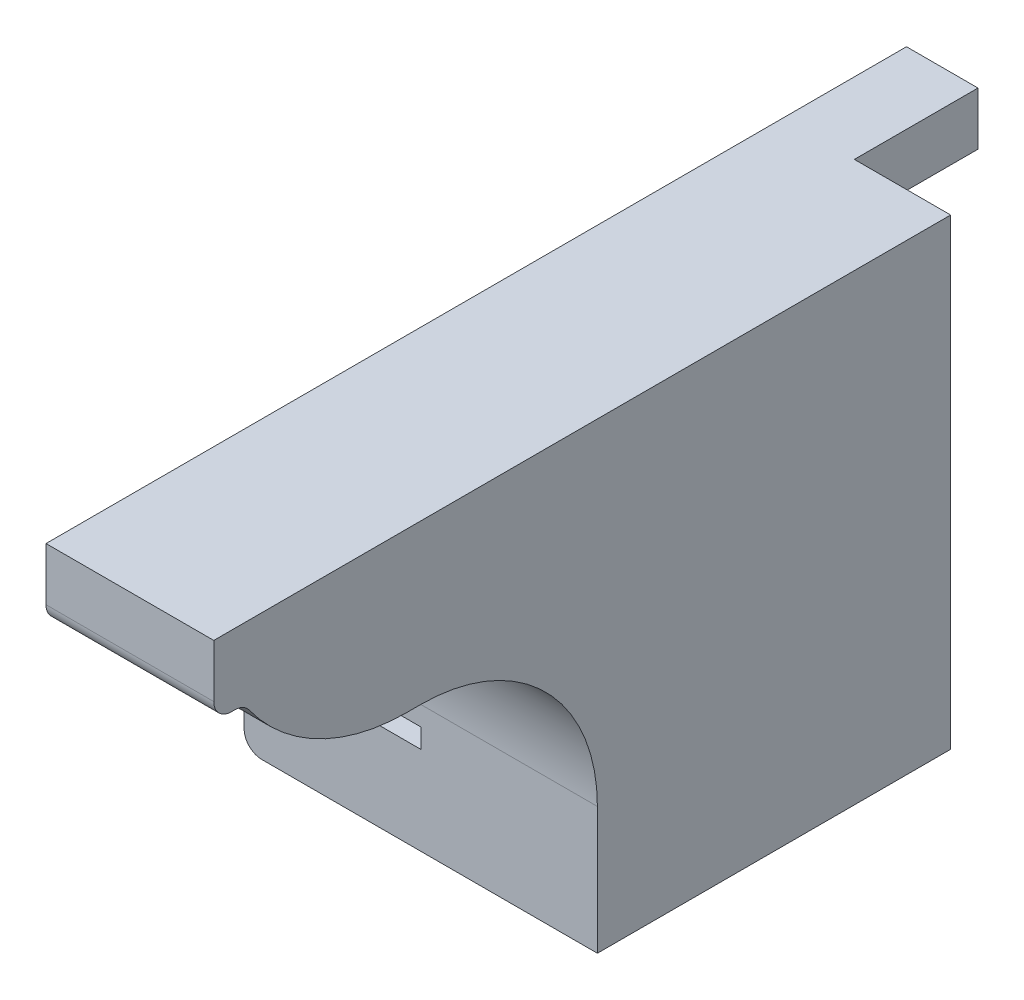
ISO-10303-21;
HEADER;
FILE_DESCRIPTION(('STEP AP214'),'2;1');
FILE_NAME('part.step','',(''),(''),'','','');
FILE_SCHEMA(('AUTOMOTIVE_DESIGN { 1 0 10303 214 1 1 1 1 }'));
ENDSEC;
DATA;
#1=APPLICATION_CONTEXT('core data for automotive mechanical design processes');
#2=APPLICATION_PROTOCOL_DEFINITION('international standard','automotive_design',2000,#1);
#3=PRODUCT_CONTEXT('',#1,'mechanical');
#4=PRODUCT('Part','Part','',(#3));
#5=PRODUCT_RELATED_PRODUCT_CATEGORY('part','',(#4));
#6=PRODUCT_DEFINITION_FORMATION('','',#4);
#7=PRODUCT_DEFINITION_CONTEXT('part definition',#1,'design');
#8=PRODUCT_DEFINITION('design','',#6,#7);
#9=PRODUCT_DEFINITION_SHAPE('','',#8);
#10=(LENGTH_UNIT() NAMED_UNIT(*) SI_UNIT(.MILLI.,.METRE.));
#11=(NAMED_UNIT(*) PLANE_ANGLE_UNIT() SI_UNIT($,.RADIAN.));
#12=(NAMED_UNIT(*) SI_UNIT($,.STERADIAN.) SOLID_ANGLE_UNIT());
#13=UNCERTAINTY_MEASURE_WITH_UNIT(LENGTH_MEASURE(1.E-05),#10,'distance_accuracy_value','');
#14=(GEOMETRIC_REPRESENTATION_CONTEXT(3) GLOBAL_UNCERTAINTY_ASSIGNED_CONTEXT((#13)) GLOBAL_UNIT_ASSIGNED_CONTEXT((#10,
#11,#12)) REPRESENTATION_CONTEXT('',''));
#15=CARTESIAN_POINT('',(0.,0.,0.));
#16=DIRECTION('',(0.,0.,1.));
#17=DIRECTION('',(1.,0.,0.));
#18=AXIS2_PLACEMENT_3D('',#15,#16,#17);
#19=CARTESIAN_POINT('',(0.,0.,10.));
#20=DIRECTION('',(0.,-1.,0.));
#21=DIRECTION('',(0.,0.,-1.));
#22=AXIS2_PLACEMENT_3D('',#19,#20,#21);
#23=PLANE('',#22);
#24=DIRECTION('',(0.,0.,-1.));
#25=VECTOR('',#24,1.);
#26=CARTESIAN_POINT('',(0.5,0.,31.718482058147));
#27=LINE('',#26,#25);
#28=CARTESIAN_POINT('',(0.5,0.,30.));
#29=VERTEX_POINT('',#28);
#30=CARTESIAN_POINT('',(0.5,0.,0.));
#31=VERTEX_POINT('',#30);
#32=EDGE_CURVE('E278',#29,#31,#27,.T.);
#33=ORIENTED_EDGE('',*,*,#32,.T.);
#34=DIRECTION('',(-1.,0.,0.));
#35=VECTOR('',#34,1.);
#36=CARTESIAN_POINT('',(0.,0.,0.));
#37=LINE('',#36,#35);
#38=CARTESIAN_POINT('',(0.,0.,0.));
#39=VERTEX_POINT('',#38);
#40=EDGE_CURVE('E331',#31,#39,#37,.T.);
#41=ORIENTED_EDGE('',*,*,#40,.T.);
#42=DIRECTION('',(0.,0.,-1.));
#43=VECTOR('',#42,1.);
#44=CARTESIAN_POINT('',(0.,0.,10.));
#45=LINE('',#44,#43);
#46=CARTESIAN_POINT('',(0.,0.,30.));
#47=VERTEX_POINT('',#46);
#48=EDGE_CURVE('E356',#47,#39,#45,.T.);
#49=ORIENTED_EDGE('',*,*,#48,.F.);
#50=DIRECTION('',(-1.,0.,0.));
#51=VECTOR('',#50,1.);
#52=CARTESIAN_POINT('',(10.,0.,30.));
#53=LINE('',#52,#51);
#54=EDGE_CURVE('E308',#29,#47,#53,.T.);
#55=ORIENTED_EDGE('',*,*,#54,.F.);
#56=EDGE_LOOP('',(#33,#41,#49,#55));
#57=FACE_BOUND('',#56,.T.);
#58=ADVANCED_FACE('F33',(#57),#23,.F.);
#59=CARTESIAN_POINT('',(0.,0.,10.));
#60=DIRECTION('',(0.,0.,-1.));
#61=DIRECTION('',(-1.,0.,0.));
#62=AXIS2_PLACEMENT_3D('',#59,#60,#61);
#63=PLANE('',#62);
#64=DIRECTION('',(0.,-1.,0.));
#65=VECTOR('',#64,1.);
#66=CARTESIAN_POINT('',(-10.,-22.2,10.));
#67=LINE('',#66,#65);
#68=CARTESIAN_POINT('',(-10.,-18.2,10.));
#69=VERTEX_POINT('',#68);
#70=CARTESIAN_POINT('',(-10.,-21.2,10.));
#71=VERTEX_POINT('',#70);
#72=EDGE_CURVE('E348',#69,#71,#67,.T.);
#73=ORIENTED_EDGE('',*,*,#72,.T.);
#74=CARTESIAN_POINT('',(-9.,-21.2,10.));
#75=DIRECTION('',(0.,0.,-1.));
#76=DIRECTION('',(-1.,0.,0.));
#77=AXIS2_PLACEMENT_3D('',#74,#75,#76);
#78=CIRCLE('',#77,1.);
#79=CARTESIAN_POINT('',(-9.,-22.2,10.));
#80=VERTEX_POINT('',#79);
#81=EDGE_CURVE('E462',#71,#80,#78,.F.);
#82=ORIENTED_EDGE('',*,*,#81,.T.);
#83=DIRECTION('',(1.,0.,0.));
#84=VECTOR('',#83,1.);
#85=CARTESIAN_POINT('',(10.,-22.2,10.));
#86=LINE('',#85,#84);
#87=CARTESIAN_POINT('',(10.,-22.2,10.));
#88=VERTEX_POINT('',#87);
#89=EDGE_CURVE('E351',#80,#88,#86,.T.);
#90=ORIENTED_EDGE('',*,*,#89,.T.);
#91=DIRECTION('',(0.,1.,0.));
#92=VECTOR('',#91,1.);
#93=CARTESIAN_POINT('',(10.,0.,10.));
#94=LINE('',#93,#92);
#95=CARTESIAN_POINT('',(10.,-15.,10.));
#96=VERTEX_POINT('',#95);
#97=EDGE_CURVE('E353',#88,#96,#94,.T.);
#98=ORIENTED_EDGE('',*,*,#97,.T.);
#99=DIRECTION('',(1.,0.,0.));
#100=VECTOR('',#99,1.);
#101=CARTESIAN_POINT('',(0.,-15.,10.));
#102=LINE('',#101,#100);
#103=CARTESIAN_POINT('',(0.,-15.,10.));
#104=VERTEX_POINT('',#103);
#105=EDGE_CURVE('E412',#96,#104,#102,.F.);
#106=ORIENTED_EDGE('',*,*,#105,.T.);
#107=DIRECTION('',(0.,1.,0.));
#108=VECTOR('',#107,1.);
#109=CARTESIAN_POINT('',(0.,-5.,10.));
#110=LINE('',#109,#108);
#111=CARTESIAN_POINT('',(0.,-11.1,10.));
#112=VERTEX_POINT('',#111);
#113=EDGE_CURVE('E409',#104,#112,#110,.T.);
#114=ORIENTED_EDGE('',*,*,#113,.T.);
#115=DIRECTION('',(-1.,0.,0.));
#116=VECTOR('',#115,1.);
#117=CARTESIAN_POINT('',(-10.,-11.1,10.));
#118=LINE('',#117,#116);
#119=CARTESIAN_POINT('',(-9.,-11.1,10.));
#120=VERTEX_POINT('',#119);
#121=EDGE_CURVE('E335',#112,#120,#118,.T.);
#122=ORIENTED_EDGE('',*,*,#121,.T.);
#123=CARTESIAN_POINT('',(-9.,-12.1,10.));
#124=DIRECTION('',(0.,0.,-1.));
#125=DIRECTION('',(-1.,0.,0.));
#126=AXIS2_PLACEMENT_3D('',#123,#124,#125);
#127=CIRCLE('',#126,1.);
#128=CARTESIAN_POINT('',(-10.,-12.1,10.));
#129=VERTEX_POINT('',#128);
#130=EDGE_CURVE('E456',#120,#129,#127,.F.);
#131=ORIENTED_EDGE('',*,*,#130,.T.);
#132=DIRECTION('',(0.,-1.,0.));
#133=VECTOR('',#132,1.);
#134=CARTESIAN_POINT('',(-10.,-16.1,10.));
#135=LINE('',#134,#133);
#136=CARTESIAN_POINT('',(-10.,-15.1,10.));
#137=VERTEX_POINT('',#136);
#138=EDGE_CURVE('E338',#129,#137,#135,.T.);
#139=ORIENTED_EDGE('',*,*,#138,.T.);
#140=CARTESIAN_POINT('',(-9.,-15.1,10.));
#141=DIRECTION('',(0.,0.,-1.));
#142=DIRECTION('',(-1.,0.,0.));
#143=AXIS2_PLACEMENT_3D('',#140,#141,#142);
#144=CIRCLE('',#143,1.);
#145=CARTESIAN_POINT('',(-9.,-16.1,10.));
#146=VERTEX_POINT('',#145);
#147=EDGE_CURVE('E458',#137,#146,#144,.F.);
#148=ORIENTED_EDGE('',*,*,#147,.T.);
#149=DIRECTION('',(1.,0.,0.));
#150=VECTOR('',#149,1.);
#151=CARTESIAN_POINT('',(0.,-16.1,10.));
#152=LINE('',#151,#150);
#153=CARTESIAN_POINT('',(0.,-16.1,10.));
#154=VERTEX_POINT('',#153);
#155=EDGE_CURVE('E341',#146,#154,#152,.T.);
#156=ORIENTED_EDGE('',*,*,#155,.T.);
#157=DIRECTION('',(0.,-1.,0.));
#158=VECTOR('',#157,1.);
#159=CARTESIAN_POINT('',(0.,-17.2,10.));
#160=LINE('',#159,#158);
#161=CARTESIAN_POINT('',(0.,-17.2,10.));
#162=VERTEX_POINT('',#161);
#163=EDGE_CURVE('E343',#154,#162,#160,.T.);
#164=ORIENTED_EDGE('',*,*,#163,.T.);
#165=DIRECTION('',(-1.,0.,0.));
#166=VECTOR('',#165,1.);
#167=CARTESIAN_POINT('',(-10.,-17.2,10.));
#168=LINE('',#167,#166);
#169=CARTESIAN_POINT('',(-9.,-17.2,10.));
#170=VERTEX_POINT('',#169);
#171=EDGE_CURVE('E345',#162,#170,#168,.T.);
#172=ORIENTED_EDGE('',*,*,#171,.T.);
#173=CARTESIAN_POINT('',(-9.,-18.2,10.));
#174=DIRECTION('',(0.,0.,-1.));
#175=DIRECTION('',(-1.,0.,0.));
#176=AXIS2_PLACEMENT_3D('',#173,#174,#175);
#177=CIRCLE('',#176,1.);
#178=EDGE_CURVE('E460',#170,#69,#177,.F.);
#179=ORIENTED_EDGE('',*,*,#178,.T.);
#180=EDGE_LOOP('',(#73,#82,#90,#98,#106,#114,#122,#131,#139,#148,#156,#164,#172,#179));
#181=FACE_BOUND('',#180,.T.);
#182=ADVANCED_FACE('F555',(#181),#63,.F.);
#183=DIRECTION('',(0.707106781186549,0.707106781186546,0.));
#184=VECTOR('',#183,1.);
#185=CARTESIAN_POINT('',(-10.,-9.00000000000001,10.));
#186=LINE('',#185,#184);
#187=CARTESIAN_POINT('',(-5.99999999999998,-5.,10.));
#188=VERTEX_POINT('',#187);
#189=CARTESIAN_POINT('',(-9.70710678118655,-8.70710678118656,10.));
#190=VERTEX_POINT('',#189);
#191=EDGE_CURVE('E424',#188,#190,#186,.F.);
#192=ORIENTED_EDGE('',*,*,#191,.T.);
#193=CARTESIAN_POINT('',(-9.,-9.41421356237311,10.));
#194=DIRECTION('',(0.,0.,-1.));
#195=DIRECTION('',(-1.,0.,0.));
#196=AXIS2_PLACEMENT_3D('',#193,#194,#195);
#197=CIRCLE('',#196,1.);
#198=CARTESIAN_POINT('',(-9.97831834347852,-9.20710678118656,10.));
#199=VERTEX_POINT('',#198);
#200=EDGE_CURVE('E444',#190,#199,#197,.F.);
#201=ORIENTED_EDGE('',*,*,#200,.T.);
#202=CARTESIAN_POINT('',(-9.,-9.,10.));
#203=DIRECTION('',(0.,0.,-1.));
#204=DIRECTION('',(-1.,0.,0.));
#205=AXIS2_PLACEMENT_3D('',#202,#203,#204);
#206=CIRCLE('',#205,1.);
#207=CARTESIAN_POINT('',(-9.,-10.,10.));
#208=VERTEX_POINT('',#207);
#209=EDGE_CURVE('E442',#199,#208,#206,.F.);
#210=ORIENTED_EDGE('',*,*,#209,.T.);
#211=DIRECTION('',(1.,0.,0.));
#212=VECTOR('',#211,1.);
#213=CARTESIAN_POINT('',(0.,-10.,10.));
#214=LINE('',#213,#212);
#215=CARTESIAN_POINT('',(0.,-10.,10.));
#216=VERTEX_POINT('',#215);
#217=EDGE_CURVE('E330',#208,#216,#214,.T.);
#218=ORIENTED_EDGE('',*,*,#217,.T.);
#219=DIRECTION('',(0.,1.,0.));
#220=VECTOR('',#219,1.);
#221=CARTESIAN_POINT('',(0.,-5.,10.));
#222=LINE('',#221,#220);
#223=CARTESIAN_POINT('',(0.,-5.,10.));
#224=VERTEX_POINT('',#223);
#225=EDGE_CURVE('E407',#216,#224,#222,.T.);
#226=ORIENTED_EDGE('',*,*,#225,.T.);
#227=DIRECTION('',(-1.,0.,0.));
#228=VECTOR('',#227,1.);
#229=CARTESIAN_POINT('',(-10.,-5.,10.));
#230=LINE('',#229,#228);
#231=EDGE_CURVE('E327',#224,#188,#230,.T.);
#232=ORIENTED_EDGE('',*,*,#231,.T.);
#233=EDGE_LOOP('',(#192,#201,#210,#218,#226,#232));
#234=FACE_BOUND('',#233,.T.);
#235=ADVANCED_FACE('F629',(#234),#63,.F.);
#236=CARTESIAN_POINT('',(0.,-5.,10.));
#237=DIRECTION('',(1.,0.,0.));
#238=DIRECTION('',(0.,0.,-1.));
#239=AXIS2_PLACEMENT_3D('',#236,#237,#238);
#240=PLANE('',#239);
#241=DIRECTION('',(0.,0.,-1.));
#242=VECTOR('',#241,1.);
#243=CARTESIAN_POINT('',(0.,-5.,30.));
#244=LINE('',#243,#242);
#245=CARTESIAN_POINT('',(0.,-5.,20.7804555427071));
#246=VERTEX_POINT('',#245);
#247=CARTESIAN_POINT('',(0.,-5.,20.));
#248=VERTEX_POINT('',#247);
#249=EDGE_CURVE('E313',#246,#248,#244,.T.);
#250=ORIENTED_EDGE('',*,*,#249,.F.);
#251=CARTESIAN_POINT('',(0.,6.,20.7804555427071));
#252=DIRECTION('',(1.,0.,0.));
#253=DIRECTION('',(0.,0.,-1.));
#254=AXIS2_PLACEMENT_3D('',#251,#252,#253);
#255=CIRCLE('',#254,11.);
#256=EDGE_CURVE('E482',#246,#47,#255,.F.);
#257=ORIENTED_EDGE('',*,*,#256,.T.);
#258=ORIENTED_EDGE('',*,*,#48,.T.);
#259=DIRECTION('',(0.,-1.,0.));
#260=VECTOR('',#259,1.);
#261=CARTESIAN_POINT('',(0.,-5.,0.));
#262=LINE('',#261,#260);
#263=CARTESIAN_POINT('',(0.,-5.,0.));
#264=VERTEX_POINT('',#263);
#265=EDGE_CURVE('E326',#39,#264,#262,.T.);
#266=ORIENTED_EDGE('',*,*,#265,.T.);
#267=DIRECTION('',(0.,0.,-1.));
#268=VECTOR('',#267,1.);
#269=CARTESIAN_POINT('',(0.,-5.,10.));
#270=LINE('',#269,#268);
#271=EDGE_CURVE('E401',#224,#264,#270,.T.);
#272=ORIENTED_EDGE('',*,*,#271,.F.);
#273=ORIENTED_EDGE('',*,*,#225,.F.);
#274=DIRECTION('',(0.,-1.,0.));
#275=VECTOR('',#274,1.);
#276=CARTESIAN_POINT('',(0.,-11.1,10.));
#277=LINE('',#276,#275);
#278=EDGE_CURVE('E333',#216,#112,#277,.T.);
#279=ORIENTED_EDGE('',*,*,#278,.T.);
#280=ORIENTED_EDGE('',*,*,#113,.F.);
#281=CARTESIAN_POINT('',(0.,-15.,20.));
#282=DIRECTION('',(1.,0.,0.));
#283=DIRECTION('',(0.,0.,-1.));
#284=AXIS2_PLACEMENT_3D('',#281,#282,#283);
#285=CIRCLE('',#284,10.);
#286=EDGE_CURVE('E417',#104,#248,#285,.T.);
#287=ORIENTED_EDGE('',*,*,#286,.T.);
#288=EDGE_LOOP('',(#250,#257,#258,#266,#272,#273,#279,#280,#287));
#289=FACE_BOUND('',#288,.T.);
#290=ADVANCED_FACE('F544',(#289),#240,.F.);
#291=CARTESIAN_POINT('',(-10.,-5.,10.));
#292=DIRECTION('',(0.,-1.,0.));
#293=DIRECTION('',(0.,0.,-1.));
#294=AXIS2_PLACEMENT_3D('',#291,#292,#293);
#295=PLANE('',#294);
#296=DIRECTION('',(-1.,0.,0.));
#297=VECTOR('',#296,1.);
#298=CARTESIAN_POINT('',(-10.,-5.,0.));
#299=LINE('',#298,#297);
#300=CARTESIAN_POINT('',(-5.99999999999998,-5.,0.));
#301=VERTEX_POINT('',#300);
#302=EDGE_CURVE('E359',#264,#301,#299,.T.);
#303=ORIENTED_EDGE('',*,*,#302,.T.);
#304=DIRECTION('',(0.,0.,1.));
#305=VECTOR('',#304,1.);
#306=CARTESIAN_POINT('',(-5.99999999999998,-5.,10.));
#307=LINE('',#306,#305);
#308=EDGE_CURVE('E422',#301,#188,#307,.T.);
#309=ORIENTED_EDGE('',*,*,#308,.T.);
#310=ORIENTED_EDGE('',*,*,#231,.F.);
#311=ORIENTED_EDGE('',*,*,#271,.T.);
#312=EDGE_LOOP('',(#303,#309,#310,#311));
#313=FACE_BOUND('',#312,.T.);
#314=ADVANCED_FACE('F626',(#313),#295,.F.);
#315=CARTESIAN_POINT('',(0.,-10.,10.));
#316=DIRECTION('',(0.,1.,0.));
#317=DIRECTION('',(-1.,0.,0.));
#318=AXIS2_PLACEMENT_3D('',#315,#316,#317);
#319=PLANE('',#318);
#320=ORIENTED_EDGE('',*,*,#217,.F.);
#321=DIRECTION('',(0.,0.,-1.));
#322=VECTOR('',#321,1.);
#323=CARTESIAN_POINT('',(-9.,-10.,10.));
#324=LINE('',#323,#322);
#325=CARTESIAN_POINT('',(-9.,-10.,0.));
#326=VERTEX_POINT('',#325);
#327=EDGE_CURVE('E446',#208,#326,#324,.T.);
#328=ORIENTED_EDGE('',*,*,#327,.T.);
#329=DIRECTION('',(1.,0.,0.));
#330=VECTOR('',#329,1.);
#331=CARTESIAN_POINT('',(0.,-10.,0.));
#332=LINE('',#331,#330);
#333=CARTESIAN_POINT('',(0.,-10.,0.));
#334=VERTEX_POINT('',#333);
#335=EDGE_CURVE('E362',#326,#334,#332,.T.);
#336=ORIENTED_EDGE('',*,*,#335,.T.);
#337=DIRECTION('',(0.,0.,-1.));
#338=VECTOR('',#337,1.);
#339=CARTESIAN_POINT('',(0.,-10.,10.));
#340=LINE('',#339,#338);
#341=EDGE_CURVE('E398',#216,#334,#340,.T.);
#342=ORIENTED_EDGE('',*,*,#341,.F.);
#343=EDGE_LOOP('',(#320,#328,#336,#342));
#344=FACE_BOUND('',#343,.T.);
#345=ADVANCED_FACE('F632',(#344),#319,.F.);
#346=CARTESIAN_POINT('',(0.,-11.1,10.));
#347=DIRECTION('',(1.,0.,0.));
#348=DIRECTION('',(0.,0.,-1.));
#349=AXIS2_PLACEMENT_3D('',#346,#347,#348);
#350=PLANE('',#349);
#351=DIRECTION('',(0.,-1.,0.));
#352=VECTOR('',#351,1.);
#353=CARTESIAN_POINT('',(0.,-11.1,0.));
#354=LINE('',#353,#352);
#355=CARTESIAN_POINT('',(0.,-11.1,0.));
#356=VERTEX_POINT('',#355);
#357=EDGE_CURVE('E364',#334,#356,#354,.T.);
#358=ORIENTED_EDGE('',*,*,#357,.T.);
#359=DIRECTION('',(0.,0.,-1.));
#360=VECTOR('',#359,1.);
#361=CARTESIAN_POINT('',(0.,-11.1,10.));
#362=LINE('',#361,#360);
#363=EDGE_CURVE('E395',#112,#356,#362,.T.);
#364=ORIENTED_EDGE('',*,*,#363,.F.);
#365=ORIENTED_EDGE('',*,*,#278,.F.);
#366=ORIENTED_EDGE('',*,*,#341,.T.);
#367=EDGE_LOOP('',(#358,#364,#365,#366));
#368=FACE_BOUND('',#367,.T.);
#369=ADVANCED_FACE('F605',(#368),#350,.F.);
#370=CARTESIAN_POINT('',(-10.,-11.1,10.));
#371=DIRECTION('',(0.,-1.,0.));
#372=DIRECTION('',(0.,0.,-1.));
#373=AXIS2_PLACEMENT_3D('',#370,#371,#372);
#374=PLANE('',#373);
#375=DIRECTION('',(-1.,0.,0.));
#376=VECTOR('',#375,1.);
#377=CARTESIAN_POINT('',(-10.,-11.1,0.));
#378=LINE('',#377,#376);
#379=CARTESIAN_POINT('',(-9.,-11.1,0.));
#380=VERTEX_POINT('',#379);
#381=EDGE_CURVE('E366',#356,#380,#378,.T.);
#382=ORIENTED_EDGE('',*,*,#381,.T.);
#383=DIRECTION('',(0.,0.,-1.));
#384=VECTOR('',#383,1.);
#385=CARTESIAN_POINT('',(-9.,-11.1,10.));
#386=LINE('',#385,#384);
#387=EDGE_CURVE('E474',#380,#120,#386,.F.);
#388=ORIENTED_EDGE('',*,*,#387,.T.);
#389=ORIENTED_EDGE('',*,*,#121,.F.);
#390=ORIENTED_EDGE('',*,*,#363,.T.);
#391=EDGE_LOOP('',(#382,#388,#389,#390));
#392=FACE_BOUND('',#391,.T.);
#393=ADVANCED_FACE('F602',(#392),#374,.F.);
#394=CARTESIAN_POINT('',(-10.,-16.1,10.));
#395=DIRECTION('',(1.,0.,0.));
#396=DIRECTION('',(0.,0.,-1.));
#397=AXIS2_PLACEMENT_3D('',#394,#395,#396);
#398=PLANE('',#397);
#399=DIRECTION('',(0.,-1.,0.));
#400=VECTOR('',#399,1.);
#401=CARTESIAN_POINT('',(-10.,-16.1,0.));
#402=LINE('',#401,#400);
#403=CARTESIAN_POINT('',(-10.,-12.1,0.));
#404=VERTEX_POINT('',#403);
#405=CARTESIAN_POINT('',(-10.,-15.1,0.));
#406=VERTEX_POINT('',#405);
#407=EDGE_CURVE('E369',#404,#406,#402,.T.);
#408=ORIENTED_EDGE('',*,*,#407,.T.);
#409=DIRECTION('',(0.,0.,-1.));
#410=VECTOR('',#409,1.);
#411=CARTESIAN_POINT('',(-10.,-15.1,10.));
#412=LINE('',#411,#410);
#413=EDGE_CURVE('E472',#406,#137,#412,.F.);
#414=ORIENTED_EDGE('',*,*,#413,.T.);
#415=ORIENTED_EDGE('',*,*,#138,.F.);
#416=DIRECTION('',(0.,0.,-1.));
#417=VECTOR('',#416,1.);
#418=CARTESIAN_POINT('',(-10.,-12.1,10.));
#419=LINE('',#418,#417);
#420=EDGE_CURVE('E469',#129,#404,#419,.T.);
#421=ORIENTED_EDGE('',*,*,#420,.T.);
#422=EDGE_LOOP('',(#408,#414,#415,#421));
#423=FACE_BOUND('',#422,.T.);
#424=ADVANCED_FACE('F592',(#423),#398,.F.);
#425=CARTESIAN_POINT('',(0.,-16.1,10.));
#426=DIRECTION('',(0.,1.,0.));
#427=DIRECTION('',(-1.,0.,0.));
#428=AXIS2_PLACEMENT_3D('',#425,#426,#427);
#429=PLANE('',#428);
#430=ORIENTED_EDGE('',*,*,#155,.F.);
#431=DIRECTION('',(0.,0.,-1.));
#432=VECTOR('',#431,1.);
#433=CARTESIAN_POINT('',(-9.,-16.1,10.));
#434=LINE('',#433,#432);
#435=CARTESIAN_POINT('',(-9.,-16.1,0.));
#436=VERTEX_POINT('',#435);
#437=EDGE_CURVE('E466',#146,#436,#434,.T.);
#438=ORIENTED_EDGE('',*,*,#437,.T.);
#439=DIRECTION('',(1.,0.,0.));
#440=VECTOR('',#439,1.);
#441=CARTESIAN_POINT('',(0.,-16.1,0.));
#442=LINE('',#441,#440);
#443=CARTESIAN_POINT('',(0.,-16.1,0.));
#444=VERTEX_POINT('',#443);
#445=EDGE_CURVE('E372',#436,#444,#442,.T.);
#446=ORIENTED_EDGE('',*,*,#445,.T.);
#447=DIRECTION('',(0.,0.,-1.));
#448=VECTOR('',#447,1.);
#449=CARTESIAN_POINT('',(0.,-16.1,10.));
#450=LINE('',#449,#448);
#451=EDGE_CURVE('E392',#154,#444,#450,.T.);
#452=ORIENTED_EDGE('',*,*,#451,.F.);
#453=EDGE_LOOP('',(#430,#438,#446,#452));
#454=FACE_BOUND('',#453,.T.);
#455=ADVANCED_FACE('F584',(#454),#429,.F.);
#456=CARTESIAN_POINT('',(0.,-17.2,10.));
#457=DIRECTION('',(1.,0.,0.));
#458=DIRECTION('',(0.,1.,0.));
#459=AXIS2_PLACEMENT_3D('',#456,#457,#458);
#460=PLANE('',#459);
#461=DIRECTION('',(0.,-1.,0.));
#462=VECTOR('',#461,1.);
#463=CARTESIAN_POINT('',(0.,-17.2,0.));
#464=LINE('',#463,#462);
#465=CARTESIAN_POINT('',(0.,-17.2,0.));
#466=VERTEX_POINT('',#465);
#467=EDGE_CURVE('E374',#444,#466,#464,.T.);
#468=ORIENTED_EDGE('',*,*,#467,.T.);
#469=DIRECTION('',(0.,0.,-1.));
#470=VECTOR('',#469,1.);
#471=CARTESIAN_POINT('',(0.,-17.2,10.));
#472=LINE('',#471,#470);
#473=EDGE_CURVE('E389',#162,#466,#472,.T.);
#474=ORIENTED_EDGE('',*,*,#473,.F.);
#475=ORIENTED_EDGE('',*,*,#163,.F.);
#476=ORIENTED_EDGE('',*,*,#451,.T.);
#477=EDGE_LOOP('',(#468,#474,#475,#476));
#478=FACE_BOUND('',#477,.T.);
#479=ADVANCED_FACE('F578',(#478),#460,.F.);
#480=CARTESIAN_POINT('',(-10.,-17.2,10.));
#481=DIRECTION('',(0.,-1.,0.));
#482=DIRECTION('',(1.,0.,0.));
#483=AXIS2_PLACEMENT_3D('',#480,#481,#482);
#484=PLANE('',#483);
#485=DIRECTION('',(-1.,0.,0.));
#486=VECTOR('',#485,1.);
#487=CARTESIAN_POINT('',(-10.,-17.2,0.));
#488=LINE('',#487,#486);
#489=CARTESIAN_POINT('',(-9.,-17.2,0.));
#490=VERTEX_POINT('',#489);
#491=EDGE_CURVE('E376',#466,#490,#488,.T.);
#492=ORIENTED_EDGE('',*,*,#491,.T.);
#493=DIRECTION('',(0.,0.,-1.));
#494=VECTOR('',#493,1.);
#495=CARTESIAN_POINT('',(-9.,-17.2,10.));
#496=LINE('',#495,#494);
#497=EDGE_CURVE('E464',#490,#170,#496,.F.);
#498=ORIENTED_EDGE('',*,*,#497,.T.);
#499=ORIENTED_EDGE('',*,*,#171,.F.);
#500=ORIENTED_EDGE('',*,*,#473,.T.);
#501=EDGE_LOOP('',(#492,#498,#499,#500));
#502=FACE_BOUND('',#501,.T.);
#503=ADVANCED_FACE('F573',(#502),#484,.F.);
#504=CARTESIAN_POINT('',(-10.,-22.2,10.));
#505=DIRECTION('',(1.,0.,0.));
#506=DIRECTION('',(0.,0.,-1.));
#507=AXIS2_PLACEMENT_3D('',#504,#505,#506);
#508=PLANE('',#507);
#509=DIRECTION('',(0.,-1.,0.));
#510=VECTOR('',#509,1.);
#511=CARTESIAN_POINT('',(-10.,-22.2,0.));
#512=LINE('',#511,#510);
#513=CARTESIAN_POINT('',(-10.,-18.2,0.));
#514=VERTEX_POINT('',#513);
#515=CARTESIAN_POINT('',(-10.,-21.2,0.));
#516=VERTEX_POINT('',#515);
#517=EDGE_CURVE('E379',#514,#516,#512,.T.);
#518=ORIENTED_EDGE('',*,*,#517,.T.);
#519=DIRECTION('',(0.,0.,-1.));
#520=VECTOR('',#519,1.);
#521=CARTESIAN_POINT('',(-10.,-21.2,10.));
#522=LINE('',#521,#520);
#523=EDGE_CURVE('E454',#516,#71,#522,.F.);
#524=ORIENTED_EDGE('',*,*,#523,.T.);
#525=ORIENTED_EDGE('',*,*,#72,.F.);
#526=DIRECTION('',(0.,0.,-1.));
#527=VECTOR('',#526,1.);
#528=CARTESIAN_POINT('',(-10.,-18.2,10.));
#529=LINE('',#528,#527);
#530=EDGE_CURVE('E451',#69,#514,#529,.T.);
#531=ORIENTED_EDGE('',*,*,#530,.T.);
#532=EDGE_LOOP('',(#518,#524,#525,#531));
#533=FACE_BOUND('',#532,.T.);
#534=ADVANCED_FACE('F563',(#533),#508,.F.);
#535=CARTESIAN_POINT('',(10.,-22.2,10.));
#536=DIRECTION('',(0.,1.,0.));
#537=DIRECTION('',(0.,0.,1.));
#538=AXIS2_PLACEMENT_3D('',#535,#536,#537);
#539=PLANE('',#538);
#540=ORIENTED_EDGE('',*,*,#89,.F.);
#541=DIRECTION('',(0.,0.,-1.));
#542=VECTOR('',#541,1.);
#543=CARTESIAN_POINT('',(-9.,-22.2,10.));
#544=LINE('',#543,#542);
#545=CARTESIAN_POINT('',(-9.,-22.2,0.));
#546=VERTEX_POINT('',#545);
#547=EDGE_CURVE('E448',#80,#546,#544,.T.);
#548=ORIENTED_EDGE('',*,*,#547,.T.);
#549=DIRECTION('',(1.,0.,0.));
#550=VECTOR('',#549,1.);
#551=CARTESIAN_POINT('',(10.,-22.2,0.));
#552=LINE('',#551,#550);
#553=CARTESIAN_POINT('',(0.499999999999999,-22.2,0.));
#554=VERTEX_POINT('',#553);
#555=EDGE_CURVE('E382',#546,#554,#552,.T.);
#556=ORIENTED_EDGE('',*,*,#555,.T.);
#557=DIRECTION('',(0.,0.,1.));
#558=VECTOR('',#557,1.);
#559=CARTESIAN_POINT('',(0.499999999999997,-22.2,-10.));
#560=LINE('',#559,#558);
#561=CARTESIAN_POINT('',(0.499999999999997,-22.2,-10.));
#562=VERTEX_POINT('',#561);
#563=EDGE_CURVE('E321',#562,#554,#560,.T.);
#564=ORIENTED_EDGE('',*,*,#563,.F.);
#565=DIRECTION('',(-1.,0.,0.));
#566=VECTOR('',#565,1.);
#567=CARTESIAN_POINT('',(10.,-22.2,-10.));
#568=LINE('',#567,#566);
#569=CARTESIAN_POINT('',(10.,-22.2,-10.));
#570=VERTEX_POINT('',#569);
#571=EDGE_CURVE('E317',#570,#562,#568,.T.);
#572=ORIENTED_EDGE('',*,*,#571,.F.);
#573=DIRECTION('',(0.,0.,-1.));
#574=VECTOR('',#573,1.);
#575=CARTESIAN_POINT('',(10.,-22.2,10.));
#576=LINE('',#575,#574);
#577=EDGE_CURVE('E387',#88,#570,#576,.T.);
#578=ORIENTED_EDGE('',*,*,#577,.F.);
#579=EDGE_LOOP('',(#540,#548,#556,#564,#572,#578));
#580=FACE_BOUND('',#579,.T.);
#581=ADVANCED_FACE('F530',(#580),#539,.F.);
#582=CARTESIAN_POINT('',(10.,0.,10.));
#583=DIRECTION('',(-1.,0.,0.));
#584=DIRECTION('',(0.,-1.,0.));
#585=AXIS2_PLACEMENT_3D('',#582,#583,#584);
#586=PLANE('',#585);
#587=DIRECTION('',(0.,1.,0.));
#588=VECTOR('',#587,1.);
#589=CARTESIAN_POINT('',(10.,4.,31.718482058147));
#590=LINE('',#589,#588);
#591=CARTESIAN_POINT('',(10.,1.,31.718482058147));
#592=VERTEX_POINT('',#591);
#593=CARTESIAN_POINT('',(10.,4.,31.718482058147));
#594=VERTEX_POINT('',#593);
#595=EDGE_CURVE('E247',#592,#594,#590,.T.);
#596=ORIENTED_EDGE('',*,*,#595,.F.);
#597=CARTESIAN_POINT('',(10.,1.,30.718482058147));
#598=DIRECTION('',(-1.,0.,0.));
#599=DIRECTION('',(0.,-1.,0.));
#600=AXIS2_PLACEMENT_3D('',#597,#598,#599);
#601=CIRCLE('',#600,1.);
#602=CARTESIAN_POINT('',(10.,0.,30.718482058147));
#603=VERTEX_POINT('',#602);
#604=EDGE_CURVE('E485',#592,#603,#601,.F.);
#605=ORIENTED_EDGE('',*,*,#604,.T.);
#606=DIRECTION('',(0.,0.,-1.));
#607=VECTOR('',#606,1.);
#608=CARTESIAN_POINT('',(10.,0.,31.718482058147));
#609=LINE('',#608,#607);
#610=CARTESIAN_POINT('',(10.,0.,30.5272498875161));
#611=VERTEX_POINT('',#610);
#612=EDGE_CURVE('E273',#603,#611,#609,.T.);
#613=ORIENTED_EDGE('',*,*,#612,.T.);
#614=CARTESIAN_POINT('',(10.,-1.,30.5272498875161));
#615=DIRECTION('',(-1.,0.,0.));
#616=DIRECTION('',(0.,-1.,0.));
#617=AXIS2_PLACEMENT_3D('',#614,#615,#616);
#618=CIRCLE('',#617,1.);
#619=CARTESIAN_POINT('',(10.,-0.416666666666668,29.7150170254487));
#620=VERTEX_POINT('',#619);
#621=EDGE_CURVE('E11',#611,#620,#618,.T.);
#622=ORIENTED_EDGE('',*,*,#621,.T.);
#623=CARTESIAN_POINT('',(10.,6.,20.7804555427071));
#624=DIRECTION('',(-1.,0.,0.));
#625=DIRECTION('',(0.,-1.,0.));
#626=AXIS2_PLACEMENT_3D('',#623,#624,#625);
#627=CIRCLE('',#626,11.);
#628=CARTESIAN_POINT('',(10.,-5.,20.7804555427071));
#629=VERTEX_POINT('',#628);
#630=EDGE_CURVE('E476',#620,#629,#627,.F.);
#631=ORIENTED_EDGE('',*,*,#630,.T.);
#632=DIRECTION('',(0.,0.,-1.));
#633=VECTOR('',#632,1.);
#634=CARTESIAN_POINT('',(10.,-5.,30.));
#635=LINE('',#634,#633);
#636=CARTESIAN_POINT('',(10.,-5.,20.));
#637=VERTEX_POINT('',#636);
#638=EDGE_CURVE('E311',#629,#637,#635,.T.);
#639=ORIENTED_EDGE('',*,*,#638,.T.);
#640=CARTESIAN_POINT('',(10.,-15.,20.));
#641=DIRECTION('',(-1.,0.,0.));
#642=DIRECTION('',(0.,-1.,0.));
#643=AXIS2_PLACEMENT_3D('',#640,#641,#642);
#644=CIRCLE('',#643,10.);
#645=EDGE_CURVE('E415',#637,#96,#644,.T.);
#646=ORIENTED_EDGE('',*,*,#645,.T.);
#647=ORIENTED_EDGE('',*,*,#97,.F.);
#648=ORIENTED_EDGE('',*,*,#577,.T.);
#649=DIRECTION('',(0.,-1.,0.));
#650=VECTOR('',#649,1.);
#651=CARTESIAN_POINT('',(10.,0.,-10.));
#652=LINE('',#651,#650);
#653=CARTESIAN_POINT('',(10.,4.,-10.));
#654=VERTEX_POINT('',#653);
#655=EDGE_CURVE('E262',#654,#570,#652,.T.);
#656=ORIENTED_EDGE('',*,*,#655,.F.);
#657=DIRECTION('',(0.,0.,-1.));
#658=VECTOR('',#657,1.);
#659=CARTESIAN_POINT('',(10.,4.,-10.));
#660=LINE('',#659,#658);
#661=EDGE_CURVE('E259',#594,#654,#660,.T.);
#662=ORIENTED_EDGE('',*,*,#661,.F.);
#663=EDGE_LOOP('',(#596,#605,#613,#622,#631,#639,#646,#647,#648,#656,#662));
#664=FACE_BOUND('',#663,.T.);
#665=ADVANCED_FACE('F260',(#664),#586,.F.);
#666=CARTESIAN_POINT('',(0.,0.,0.));
#667=DIRECTION('',(0.,0.,-1.));
#668=DIRECTION('',(-1.,0.,0.));
#669=AXIS2_PLACEMENT_3D('',#666,#667,#668);
#670=PLANE('',#669);
#671=CARTESIAN_POINT('',(-9.,-9.,0.));
#672=DIRECTION('',(0.,0.,-1.));
#673=DIRECTION('',(-1.,0.,0.));
#674=AXIS2_PLACEMENT_3D('',#671,#672,#673);
#675=CIRCLE('',#674,1.);
#676=CARTESIAN_POINT('',(-9.97831834347852,-9.20710678118656,0.));
#677=VERTEX_POINT('',#676);
#678=EDGE_CURVE('E435',#326,#677,#675,.T.);
#679=ORIENTED_EDGE('',*,*,#678,.T.);
#680=CARTESIAN_POINT('',(-9.,-9.41421356237311,0.));
#681=DIRECTION('',(0.,0.,-1.));
#682=DIRECTION('',(-1.,0.,0.));
#683=AXIS2_PLACEMENT_3D('',#680,#681,#682);
#684=CIRCLE('',#683,1.);
#685=CARTESIAN_POINT('',(-9.70710678118655,-8.70710678118656,0.));
#686=VERTEX_POINT('',#685);
#687=EDGE_CURVE('E437',#677,#686,#684,.T.);
#688=ORIENTED_EDGE('',*,*,#687,.T.);
#689=DIRECTION('',(-0.707106781186549,-0.707106781186546,0.));
#690=VECTOR('',#689,1.);
#691=CARTESIAN_POINT('',(-0.499999999999978,0.49999999999998,0.));
#692=LINE('',#691,#690);
#693=EDGE_CURVE('E420',#686,#301,#692,.F.);
#694=ORIENTED_EDGE('',*,*,#693,.T.);
#695=ORIENTED_EDGE('',*,*,#302,.F.);
#696=ORIENTED_EDGE('',*,*,#265,.F.);
#697=ORIENTED_EDGE('',*,*,#40,.F.);
#698=DIRECTION('',(0.,1.,0.));
#699=VECTOR('',#698,1.);
#700=CARTESIAN_POINT('',(0.5,0.,0.));
#701=LINE('',#700,#699);
#702=EDGE_CURVE('E315',#554,#31,#701,.T.);
#703=ORIENTED_EDGE('',*,*,#702,.F.);
#704=ORIENTED_EDGE('',*,*,#555,.F.);
#705=CARTESIAN_POINT('',(-9.,-21.2,0.));
#706=DIRECTION('',(0.,0.,-1.));
#707=DIRECTION('',(-1.,0.,0.));
#708=AXIS2_PLACEMENT_3D('',#705,#706,#707);
#709=CIRCLE('',#708,1.);
#710=EDGE_CURVE('E433',#546,#516,#709,.T.);
#711=ORIENTED_EDGE('',*,*,#710,.T.);
#712=ORIENTED_EDGE('',*,*,#517,.F.);
#713=CARTESIAN_POINT('',(-9.,-18.2,0.));
#714=DIRECTION('',(0.,0.,-1.));
#715=DIRECTION('',(-1.,0.,0.));
#716=AXIS2_PLACEMENT_3D('',#713,#714,#715);
#717=CIRCLE('',#716,1.);
#718=EDGE_CURVE('E431',#514,#490,#717,.T.);
#719=ORIENTED_EDGE('',*,*,#718,.T.);
#720=ORIENTED_EDGE('',*,*,#491,.F.);
#721=ORIENTED_EDGE('',*,*,#467,.F.);
#722=ORIENTED_EDGE('',*,*,#445,.F.);
#723=CARTESIAN_POINT('',(-9.,-15.1,0.));
#724=DIRECTION('',(0.,0.,-1.));
#725=DIRECTION('',(-1.,0.,0.));
#726=AXIS2_PLACEMENT_3D('',#723,#724,#725);
#727=CIRCLE('',#726,1.);
#728=EDGE_CURVE('E429',#436,#406,#727,.T.);
#729=ORIENTED_EDGE('',*,*,#728,.T.);
#730=ORIENTED_EDGE('',*,*,#407,.F.);
#731=CARTESIAN_POINT('',(-9.,-12.1,0.));
#732=DIRECTION('',(0.,0.,-1.));
#733=DIRECTION('',(-1.,0.,0.));
#734=AXIS2_PLACEMENT_3D('',#731,#732,#733);
#735=CIRCLE('',#734,1.);
#736=EDGE_CURVE('E427',#404,#380,#735,.T.);
#737=ORIENTED_EDGE('',*,*,#736,.T.);
#738=ORIENTED_EDGE('',*,*,#381,.F.);
#739=ORIENTED_EDGE('',*,*,#357,.F.);
#740=ORIENTED_EDGE('',*,*,#335,.F.);
#741=EDGE_LOOP('',(#679,#688,#694,#695,#696,#697,#703,#704,#711,#712,#719,#720,#721,#722,#729,
#730,#737,#738,#739,#740));
#742=FACE_BOUND('',#741,.T.);
#743=ADVANCED_FACE('F536',(#742),#670,.T.);
#744=CARTESIAN_POINT('',(0.5,0.,-10.));
#745=DIRECTION('',(1.,0.,0.));
#746=DIRECTION('',(0.,1.,0.));
#747=AXIS2_PLACEMENT_3D('',#744,#745,#746);
#748=PLANE('',#747);
#749=CARTESIAN_POINT('',(0.5,0.,30.718482058147));
#750=VERTEX_POINT('',#749);
#751=CARTESIAN_POINT('',(0.5,0.,30.5272498875161));
#752=VERTEX_POINT('',#751);
#753=EDGE_CURVE('E279',#750,#752,#27,.T.);
#754=ORIENTED_EDGE('',*,*,#753,.F.);
#755=CARTESIAN_POINT('',(0.500000000000001,1.,30.718482058147));
#756=DIRECTION('',(1.,0.,0.));
#757=DIRECTION('',(0.,1.,0.));
#758=AXIS2_PLACEMENT_3D('',#755,#756,#757);
#759=CIRCLE('',#758,1.);
#760=CARTESIAN_POINT('',(0.5,1.,31.718482058147));
#761=VERTEX_POINT('',#760);
#762=EDGE_CURVE('E491',#750,#761,#759,.F.);
#763=ORIENTED_EDGE('',*,*,#762,.T.);
#764=DIRECTION('',(0.,-1.,0.));
#765=VECTOR('',#764,1.);
#766=CARTESIAN_POINT('',(0.5,4.,31.718482058147));
#767=LINE('',#766,#765);
#768=CARTESIAN_POINT('',(0.5,4.,31.718482058147));
#769=VERTEX_POINT('',#768);
#770=EDGE_CURVE('E271',#769,#761,#767,.T.);
#771=ORIENTED_EDGE('',*,*,#770,.F.);
#772=DIRECTION('',(0.,0.,1.));
#773=VECTOR('',#772,1.);
#774=CARTESIAN_POINT('',(0.5,4.,-10.));
#775=LINE('',#774,#773);
#776=CARTESIAN_POINT('',(0.5,4.,-17.));
#777=VERTEX_POINT('',#776);
#778=EDGE_CURVE('E267',#777,#769,#775,.T.);
#779=ORIENTED_EDGE('',*,*,#778,.F.);
#780=DIRECTION('',(0.,1.,0.));
#781=VECTOR('',#780,1.);
#782=CARTESIAN_POINT('',(0.5,4.,-17.));
#783=LINE('',#782,#781);
#784=CARTESIAN_POINT('',(0.5,1.,-17.));
#785=VERTEX_POINT('',#784);
#786=EDGE_CURVE('E282',#785,#777,#783,.T.);
#787=ORIENTED_EDGE('',*,*,#786,.F.);
#788=DIRECTION('',(0.,0.,1.));
#789=VECTOR('',#788,1.);
#790=CARTESIAN_POINT('',(0.5,1.,-17.));
#791=LINE('',#790,#789);
#792=CARTESIAN_POINT('',(0.500000000000001,0.999999999999999,-10.));
#793=VERTEX_POINT('',#792);
#794=EDGE_CURVE('E292',#785,#793,#791,.T.);
#795=ORIENTED_EDGE('',*,*,#794,.T.);
#796=DIRECTION('',(0.,1.,0.));
#797=VECTOR('',#796,1.);
#798=CARTESIAN_POINT('',(0.5,0.,-10.));
#799=LINE('',#798,#797);
#800=EDGE_CURVE('E319',#562,#793,#799,.T.);
#801=ORIENTED_EDGE('',*,*,#800,.F.);
#802=ORIENTED_EDGE('',*,*,#563,.T.);
#803=ORIENTED_EDGE('',*,*,#702,.T.);
#804=ORIENTED_EDGE('',*,*,#32,.F.);
#805=CARTESIAN_POINT('',(0.500000000000001,6.,20.7804555427071));
#806=DIRECTION('',(1.,0.,0.));
#807=DIRECTION('',(0.,1.,0.));
#808=AXIS2_PLACEMENT_3D('',#805,#806,#807);
#809=CIRCLE('',#808,11.);
#810=CARTESIAN_POINT('',(0.5,-0.416666666666669,29.7150170254487));
#811=VERTEX_POINT('',#810);
#812=EDGE_CURVE('E493',#811,#29,#809,.F.);
#813=ORIENTED_EDGE('',*,*,#812,.F.);
#814=CARTESIAN_POINT('',(0.5,-1.,30.5272498875161));
#815=DIRECTION('',(1.,0.,0.));
#816=DIRECTION('',(0.,1.,0.));
#817=AXIS2_PLACEMENT_3D('',#814,#815,#816);
#818=CIRCLE('',#817,1.);
#819=EDGE_CURVE('E41',#811,#752,#818,.T.);
#820=ORIENTED_EDGE('',*,*,#819,.T.);
#821=EDGE_LOOP('',(#754,#763,#771,#779,#787,#795,#801,#802,#803,#804,#813,#820));
#822=FACE_BOUND('',#821,.T.);
#823=ADVANCED_FACE('F511',(#822),#748,.F.);
#824=CARTESIAN_POINT('',(0.,0.,-10.));
#825=DIRECTION('',(0.,0.,-1.));
#826=DIRECTION('',(-1.,0.,0.));
#827=AXIS2_PLACEMENT_3D('',#824,#825,#826);
#828=PLANE('',#827);
#829=DIRECTION('',(-1.,0.,0.));
#830=VECTOR('',#829,1.);
#831=CARTESIAN_POINT('',(0.5,1.,-10.));
#832=LINE('',#831,#830);
#833=CARTESIAN_POINT('',(4.5489478809202,0.999999999999999,-10.));
#834=VERTEX_POINT('',#833);
#835=EDGE_CURVE('E286',#834,#793,#832,.T.);
#836=ORIENTED_EDGE('',*,*,#835,.F.);
#837=DIRECTION('',(0.,-1.,0.));
#838=VECTOR('',#837,1.);
#839=CARTESIAN_POINT('',(4.5489478809202,4.,-10.));
#840=LINE('',#839,#838);
#841=CARTESIAN_POINT('',(4.5489478809202,4.,-10.));
#842=VERTEX_POINT('',#841);
#843=EDGE_CURVE('E281',#842,#834,#840,.T.);
#844=ORIENTED_EDGE('',*,*,#843,.F.);
#845=DIRECTION('',(-1.,0.,0.));
#846=VECTOR('',#845,1.);
#847=CARTESIAN_POINT('',(0.5,4.,-10.));
#848=LINE('',#847,#846);
#849=EDGE_CURVE('E266',#654,#842,#848,.T.);
#850=ORIENTED_EDGE('',*,*,#849,.F.);
#851=ORIENTED_EDGE('',*,*,#655,.T.);
#852=ORIENTED_EDGE('',*,*,#571,.T.);
#853=ORIENTED_EDGE('',*,*,#800,.T.);
#854=EDGE_LOOP('',(#836,#844,#850,#851,#852,#853));
#855=FACE_BOUND('',#854,.T.);
#856=ADVANCED_FACE('F525',(#855),#828,.T.);
#857=CARTESIAN_POINT('',(10.,-5.,30.));
#858=DIRECTION('',(0.,1.,0.));
#859=DIRECTION('',(0.,0.,1.));
#860=AXIS2_PLACEMENT_3D('',#857,#858,#859);
#861=PLANE('',#860);
#862=ORIENTED_EDGE('',*,*,#638,.F.);
#863=DIRECTION('',(-1.,0.,0.));
#864=VECTOR('',#863,1.);
#865=CARTESIAN_POINT('',(10.,-5.,20.7804555427071));
#866=LINE('',#865,#864);
#867=EDGE_CURVE('E480',#629,#246,#866,.T.);
#868=ORIENTED_EDGE('',*,*,#867,.T.);
#869=ORIENTED_EDGE('',*,*,#249,.T.);
#870=DIRECTION('',(1.,0.,0.));
#871=VECTOR('',#870,1.);
#872=CARTESIAN_POINT('',(10.,-5.,20.));
#873=LINE('',#872,#871);
#874=EDGE_CURVE('E404',#248,#637,#873,.T.);
#875=ORIENTED_EDGE('',*,*,#874,.T.);
#876=EDGE_LOOP('',(#862,#868,#869,#875));
#877=FACE_BOUND('',#876,.T.);
#878=ADVANCED_FACE('F548',(#877),#861,.F.);
#879=CARTESIAN_POINT('',(10.,-15.,20.));
#880=DIRECTION('',(-1.,0.,0.));
#881=DIRECTION('',(0.,0.,1.));
#882=AXIS2_PLACEMENT_3D('',#879,#880,#881);
#883=CYLINDRICAL_SURFACE('',#882,10.);
#884=ORIENTED_EDGE('',*,*,#286,.F.);
#885=ORIENTED_EDGE('',*,*,#105,.F.);
#886=ORIENTED_EDGE('',*,*,#645,.F.);
#887=ORIENTED_EDGE('',*,*,#874,.F.);
#888=EDGE_LOOP('',(#884,#885,#886,#887));
#889=FACE_BOUND('',#888,.T.);
#890=ADVANCED_FACE('F553',(#889),#883,.F.);
#891=CARTESIAN_POINT('',(-10.,-9.00000000000001,10.));
#892=DIRECTION('',(0.707106781186546,-0.707106781186549,0.));
#893=DIRECTION('',(0.,0.,-1.));
#894=AXIS2_PLACEMENT_3D('',#891,#892,#893);
#895=PLANE('',#894);
#896=ORIENTED_EDGE('',*,*,#693,.F.);
#897=DIRECTION('',(0.,0.,-1.));
#898=VECTOR('',#897,1.);
#899=CARTESIAN_POINT('',(-9.70710678118655,-8.70710678118656,10.));
#900=LINE('',#899,#898);
#901=EDGE_CURVE('E439',#686,#190,#900,.F.);
#902=ORIENTED_EDGE('',*,*,#901,.T.);
#903=ORIENTED_EDGE('',*,*,#191,.F.);
#904=ORIENTED_EDGE('',*,*,#308,.F.);
#905=EDGE_LOOP('',(#896,#902,#903,#904));
#906=FACE_BOUND('',#905,.T.);
#907=ADVANCED_FACE('F622',(#906),#895,.F.);
#908=CARTESIAN_POINT('',(-9.,-9.,10.));
#909=DIRECTION('',(0.,0.,-1.));
#910=DIRECTION('',(-1.,0.,0.));
#911=AXIS2_PLACEMENT_3D('',#908,#909,#910);
#912=CYLINDRICAL_SURFACE('',#911,1.);
#913=ORIENTED_EDGE('',*,*,#327,.F.);
#914=ORIENTED_EDGE('',*,*,#209,.F.);
#915=DIRECTION('',(0.,0.,-1.));
#916=VECTOR('',#915,1.);
#917=CARTESIAN_POINT('',(-9.97831834347852,-9.20710678118656,5.));
#918=LINE('',#917,#916);
#919=EDGE_CURVE('E307',#677,#199,#918,.F.);
#920=ORIENTED_EDGE('',*,*,#919,.F.);
#921=ORIENTED_EDGE('',*,*,#678,.F.);
#922=EDGE_LOOP('',(#913,#914,#920,#921));
#923=FACE_BOUND('',#922,.T.);
#924=ADVANCED_FACE('F613',(#923),#912,.T.);
#925=CARTESIAN_POINT('',(-9.,-9.41421356237311,10.));
#926=DIRECTION('',(0.,0.,-1.));
#927=DIRECTION('',(-1.,0.,0.));
#928=AXIS2_PLACEMENT_3D('',#925,#926,#927);
#929=CYLINDRICAL_SURFACE('',#928,1.);
#930=ORIENTED_EDGE('',*,*,#200,.F.);
#931=ORIENTED_EDGE('',*,*,#901,.F.);
#932=ORIENTED_EDGE('',*,*,#687,.F.);
#933=ORIENTED_EDGE('',*,*,#919,.T.);
#934=EDGE_LOOP('',(#930,#931,#932,#933));
#935=FACE_BOUND('',#934,.T.);
#936=ADVANCED_FACE('F618',(#935),#929,.T.);
#937=CARTESIAN_POINT('',(-9.,-21.2,10.));
#938=DIRECTION('',(0.,0.,-1.));
#939=DIRECTION('',(-1.,0.,0.));
#940=AXIS2_PLACEMENT_3D('',#937,#938,#939);
#941=CYLINDRICAL_SURFACE('',#940,1.);
#942=ORIENTED_EDGE('',*,*,#81,.F.);
#943=ORIENTED_EDGE('',*,*,#523,.F.);
#944=ORIENTED_EDGE('',*,*,#710,.F.);
#945=ORIENTED_EDGE('',*,*,#547,.F.);
#946=EDGE_LOOP('',(#942,#943,#944,#945));
#947=FACE_BOUND('',#946,.T.);
#948=ADVANCED_FACE('F559',(#947),#941,.T.);
#949=CARTESIAN_POINT('',(-9.,-18.2,10.));
#950=DIRECTION('',(0.,0.,-1.));
#951=DIRECTION('',(-1.,0.,0.));
#952=AXIS2_PLACEMENT_3D('',#949,#950,#951);
#953=CYLINDRICAL_SURFACE('',#952,1.);
#954=ORIENTED_EDGE('',*,*,#178,.F.);
#955=ORIENTED_EDGE('',*,*,#497,.F.);
#956=ORIENTED_EDGE('',*,*,#718,.F.);
#957=ORIENTED_EDGE('',*,*,#530,.F.);
#958=EDGE_LOOP('',(#954,#955,#956,#957));
#959=FACE_BOUND('',#958,.T.);
#960=ADVANCED_FACE('F568',(#959),#953,.T.);
#961=CARTESIAN_POINT('',(-9.,-15.1,10.));
#962=DIRECTION('',(0.,0.,-1.));
#963=DIRECTION('',(-1.,0.,0.));
#964=AXIS2_PLACEMENT_3D('',#961,#962,#963);
#965=CYLINDRICAL_SURFACE('',#964,1.);
#966=ORIENTED_EDGE('',*,*,#147,.F.);
#967=ORIENTED_EDGE('',*,*,#413,.F.);
#968=ORIENTED_EDGE('',*,*,#728,.F.);
#969=ORIENTED_EDGE('',*,*,#437,.F.);
#970=EDGE_LOOP('',(#966,#967,#968,#969));
#971=FACE_BOUND('',#970,.T.);
#972=ADVANCED_FACE('F588',(#971),#965,.T.);
#973=CARTESIAN_POINT('',(-9.,-12.1,10.));
#974=DIRECTION('',(0.,0.,-1.));
#975=DIRECTION('',(-1.,0.,0.));
#976=AXIS2_PLACEMENT_3D('',#973,#974,#975);
#977=CYLINDRICAL_SURFACE('',#976,1.);
#978=ORIENTED_EDGE('',*,*,#130,.F.);
#979=ORIENTED_EDGE('',*,*,#387,.F.);
#980=ORIENTED_EDGE('',*,*,#736,.F.);
#981=ORIENTED_EDGE('',*,*,#420,.F.);
#982=EDGE_LOOP('',(#978,#979,#980,#981));
#983=FACE_BOUND('',#982,.T.);
#984=ADVANCED_FACE('F598',(#983),#977,.T.);
#985=CARTESIAN_POINT('',(0.,4.,0.));
#986=DIRECTION('',(0.,1.,0.));
#987=DIRECTION('',(0.,0.,1.));
#988=AXIS2_PLACEMENT_3D('',#985,#986,#987);
#989=PLANE('',#988);
#990=ORIENTED_EDGE('',*,*,#778,.T.);
#991=DIRECTION('',(-1.,0.,0.));
#992=VECTOR('',#991,1.);
#993=CARTESIAN_POINT('',(10.,4.,31.718482058147));
#994=LINE('',#993,#992);
#995=EDGE_CURVE('E252',#594,#769,#994,.T.);
#996=ORIENTED_EDGE('',*,*,#995,.F.);
#997=ORIENTED_EDGE('',*,*,#661,.T.);
#998=ORIENTED_EDGE('',*,*,#849,.T.);
#999=DIRECTION('',(0.,0.,1.));
#1000=VECTOR('',#999,1.);
#1001=CARTESIAN_POINT('',(4.5489478809202,4.,-17.));
#1002=LINE('',#1001,#1000);
#1003=CARTESIAN_POINT('',(4.5489478809202,4.,-17.));
#1004=VERTEX_POINT('',#1003);
#1005=EDGE_CURVE('E302',#1004,#842,#1002,.T.);
#1006=ORIENTED_EDGE('',*,*,#1005,.F.);
#1007=DIRECTION('',(1.,0.,0.));
#1008=VECTOR('',#1007,1.);
#1009=CARTESIAN_POINT('',(0.5,4.,-17.));
#1010=LINE('',#1009,#1008);
#1011=EDGE_CURVE('E285',#777,#1004,#1010,.T.);
#1012=ORIENTED_EDGE('',*,*,#1011,.F.);
#1013=EDGE_LOOP('',(#990,#996,#997,#998,#1006,#1012));
#1014=FACE_BOUND('',#1013,.T.);
#1015=ADVANCED_FACE('F269',(#1014),#989,.T.);
#1016=CARTESIAN_POINT('',(4.5489478809202,4.,-17.));
#1017=DIRECTION('',(-1.,0.,0.));
#1018=DIRECTION('',(0.,0.,1.));
#1019=AXIS2_PLACEMENT_3D('',#1016,#1017,#1018);
#1020=PLANE('',#1019);
#1021=ORIENTED_EDGE('',*,*,#843,.T.);
#1022=DIRECTION('',(0.,0.,1.));
#1023=VECTOR('',#1022,1.);
#1024=CARTESIAN_POINT('',(4.5489478809202,0.999999999999999,-17.));
#1025=LINE('',#1024,#1023);
#1026=CARTESIAN_POINT('',(4.5489478809202,0.999999999999999,-17.));
#1027=VERTEX_POINT('',#1026);
#1028=EDGE_CURVE('E299',#1027,#834,#1025,.T.);
#1029=ORIENTED_EDGE('',*,*,#1028,.F.);
#1030=DIRECTION('',(0.,-1.,0.));
#1031=VECTOR('',#1030,1.);
#1032=CARTESIAN_POINT('',(4.5489478809202,4.,-17.));
#1033=LINE('',#1032,#1031);
#1034=EDGE_CURVE('E288',#1004,#1027,#1033,.T.);
#1035=ORIENTED_EDGE('',*,*,#1034,.F.);
#1036=ORIENTED_EDGE('',*,*,#1005,.T.);
#1037=EDGE_LOOP('',(#1021,#1029,#1035,#1036));
#1038=FACE_BOUND('',#1037,.T.);
#1039=ADVANCED_FACE('F778',(#1038),#1020,.F.);
#1040=CARTESIAN_POINT('',(0.5,1.,-17.));
#1041=DIRECTION('',(0.,1.,0.));
#1042=DIRECTION('',(-1.,0.,0.));
#1043=AXIS2_PLACEMENT_3D('',#1040,#1041,#1042);
#1044=PLANE('',#1043);
#1045=ORIENTED_EDGE('',*,*,#835,.T.);
#1046=ORIENTED_EDGE('',*,*,#794,.F.);
#1047=DIRECTION('',(-1.,0.,0.));
#1048=VECTOR('',#1047,1.);
#1049=CARTESIAN_POINT('',(0.5,1.,-17.));
#1050=LINE('',#1049,#1048);
#1051=EDGE_CURVE('E290',#1027,#785,#1050,.T.);
#1052=ORIENTED_EDGE('',*,*,#1051,.F.);
#1053=ORIENTED_EDGE('',*,*,#1028,.T.);
#1054=EDGE_LOOP('',(#1045,#1046,#1052,#1053));
#1055=FACE_BOUND('',#1054,.T.);
#1056=ADVANCED_FACE('F521',(#1055),#1044,.F.);
#1057=CARTESIAN_POINT('',(0.,0.,-17.));
#1058=DIRECTION('',(0.,0.,1.));
#1059=DIRECTION('',(1.,0.,0.));
#1060=AXIS2_PLACEMENT_3D('',#1057,#1058,#1059);
#1061=PLANE('',#1060);
#1062=ORIENTED_EDGE('',*,*,#786,.T.);
#1063=ORIENTED_EDGE('',*,*,#1011,.T.);
#1064=ORIENTED_EDGE('',*,*,#1034,.T.);
#1065=ORIENTED_EDGE('',*,*,#1051,.T.);
#1066=EDGE_LOOP('',(#1062,#1063,#1064,#1065));
#1067=FACE_BOUND('',#1066,.T.);
#1068=ADVANCED_FACE('F516',(#1067),#1061,.F.);
#1069=CARTESIAN_POINT('',(10.,0.,31.718482058147));
#1070=DIRECTION('',(0.,1.,0.));
#1071=DIRECTION('',(0.,0.,1.));
#1072=AXIS2_PLACEMENT_3D('',#1069,#1070,#1071);
#1073=PLANE('',#1072);
#1074=ORIENTED_EDGE('',*,*,#612,.F.);
#1075=DIRECTION('',(1.,0.,0.));
#1076=VECTOR('',#1075,1.);
#1077=CARTESIAN_POINT('',(10.,0.,30.718482058147));
#1078=LINE('',#1077,#1076);
#1079=EDGE_CURVE('E489',#603,#750,#1078,.F.);
#1080=ORIENTED_EDGE('',*,*,#1079,.T.);
#1081=ORIENTED_EDGE('',*,*,#753,.T.);
#1082=DIRECTION('',(-1.,0.,0.));
#1083=VECTOR('',#1082,1.);
#1084=CARTESIAN_POINT('',(10.,0.,30.5272498875161));
#1085=LINE('',#1084,#1083);
#1086=EDGE_CURVE('E487',#752,#611,#1085,.F.);
#1087=ORIENTED_EDGE('',*,*,#1086,.T.);
#1088=EDGE_LOOP('',(#1074,#1080,#1081,#1087));
#1089=FACE_BOUND('',#1088,.T.);
#1090=ADVANCED_FACE('F507',(#1089),#1073,.F.);
#1091=CARTESIAN_POINT('',(0.,0.,31.718482058147));
#1092=DIRECTION('',(0.,0.,-1.));
#1093=DIRECTION('',(-1.,0.,0.));
#1094=AXIS2_PLACEMENT_3D('',#1091,#1092,#1093);
#1095=PLANE('',#1094);
#1096=ORIENTED_EDGE('',*,*,#770,.T.);
#1097=DIRECTION('',(1.,0.,0.));
#1098=VECTOR('',#1097,1.);
#1099=CARTESIAN_POINT('',(0.,1.,31.718482058147));
#1100=LINE('',#1099,#1098);
#1101=EDGE_CURVE('E255',#761,#592,#1100,.T.);
#1102=ORIENTED_EDGE('',*,*,#1101,.T.);
#1103=ORIENTED_EDGE('',*,*,#595,.T.);
#1104=ORIENTED_EDGE('',*,*,#995,.T.);
#1105=EDGE_LOOP('',(#1096,#1102,#1103,#1104));
#1106=FACE_BOUND('',#1105,.T.);
#1107=ADVANCED_FACE('F250',(#1106),#1095,.F.);
#1108=CARTESIAN_POINT('',(0.,6.,20.7804555427071));
#1109=DIRECTION('',(-1.,0.,0.));
#1110=DIRECTION('',(0.,0.,1.));
#1111=AXIS2_PLACEMENT_3D('',#1108,#1109,#1110);
#1112=CYLINDRICAL_SURFACE('',#1111,11.);
#1113=ORIENTED_EDGE('',*,*,#630,.F.);
#1114=DIRECTION('',(-1.,0.,0.));
#1115=VECTOR('',#1114,1.);
#1116=CARTESIAN_POINT('',(0.,-0.416666666666668,29.7150170254487));
#1117=LINE('',#1116,#1115);
#1118=EDGE_CURVE('E495',#620,#811,#1117,.T.);
#1119=ORIENTED_EDGE('',*,*,#1118,.T.);
#1120=ORIENTED_EDGE('',*,*,#812,.T.);
#1121=ORIENTED_EDGE('',*,*,#54,.T.);
#1122=ORIENTED_EDGE('',*,*,#256,.F.);
#1123=ORIENTED_EDGE('',*,*,#867,.F.);
#1124=EDGE_LOOP('',(#1113,#1119,#1120,#1121,#1122,#1123));
#1125=FACE_BOUND('',#1124,.T.);
#1126=ADVANCED_FACE('F499',(#1125),#1112,.T.);
#1127=CARTESIAN_POINT('',(0.,1.,30.718482058147));
#1128=DIRECTION('',(1.,0.,0.));
#1129=DIRECTION('',(0.,0.,-1.));
#1130=AXIS2_PLACEMENT_3D('',#1127,#1128,#1129);
#1131=CYLINDRICAL_SURFACE('',#1130,1.);
#1132=ORIENTED_EDGE('',*,*,#762,.F.);
#1133=ORIENTED_EDGE('',*,*,#1079,.F.);
#1134=ORIENTED_EDGE('',*,*,#604,.F.);
#1135=ORIENTED_EDGE('',*,*,#1101,.F.);
#1136=EDGE_LOOP('',(#1132,#1133,#1134,#1135));
#1137=FACE_BOUND('',#1136,.T.);
#1138=ADVANCED_FACE('F510',(#1137),#1131,.T.);
#1139=CARTESIAN_POINT('',(0.,-1.,30.5272498875161));
#1140=DIRECTION('',(-1.,0.,0.));
#1141=DIRECTION('',(0.,0.,1.));
#1142=AXIS2_PLACEMENT_3D('',#1139,#1140,#1141);
#1143=CYLINDRICAL_SURFACE('',#1142,1.);
#1144=ORIENTED_EDGE('',*,*,#621,.F.);
#1145=ORIENTED_EDGE('',*,*,#1086,.F.);
#1146=ORIENTED_EDGE('',*,*,#819,.F.);
#1147=ORIENTED_EDGE('',*,*,#1118,.F.);
#1148=EDGE_LOOP('',(#1144,#1145,#1146,#1147));
#1149=FACE_BOUND('',#1148,.T.);
#1150=ADVANCED_FACE('F35',(#1149),#1143,.F.);
#1151=CLOSED_SHELL('',(#58,#182,#235,#290,#314,#345,#369,#393,#424,#455,#479,#503,#534,#581,
#665,#743,#823,#856,#878,#890,#907,#924,#936,#948,#960,#972,#984,#1015,#1039,#1056,#1068,#1090,
#1107,#1126,#1138,#1150));
#1152=MANIFOLD_SOLID_BREP('B2',#1151);
#1153=ADVANCED_BREP_SHAPE_REPRESENTATION('',(#18,#1152),#14);
#1154=SHAPE_DEFINITION_REPRESENTATION(#9,#1153);
ENDSEC;
END-ISO-10303-21;
